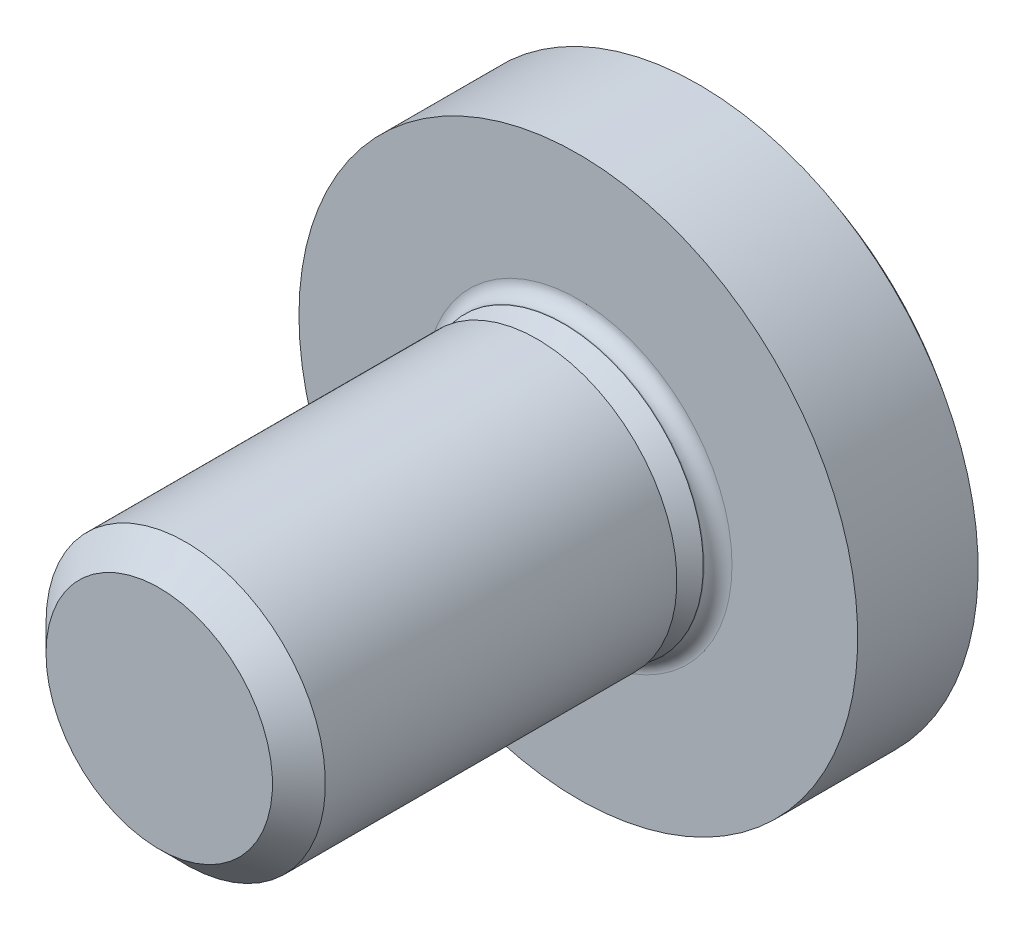
ISO-10303-21;
HEADER;
FILE_DESCRIPTION(('STEP AP214'),'2;1');
FILE_NAME('part.step','',(''),(''),'','','');
FILE_SCHEMA(('AUTOMOTIVE_DESIGN { 1 0 10303 214 1 1 1 1 }'));
ENDSEC;
DATA;
#1=APPLICATION_CONTEXT('core data for automotive mechanical design processes');
#2=APPLICATION_PROTOCOL_DEFINITION('international standard','automotive_design',2000,#1);
#3=PRODUCT_CONTEXT('',#1,'mechanical');
#4=PRODUCT('Part','Part','',(#3));
#5=PRODUCT_RELATED_PRODUCT_CATEGORY('part','',(#4));
#6=PRODUCT_DEFINITION_FORMATION('','',#4);
#7=PRODUCT_DEFINITION_CONTEXT('part definition',#1,'design');
#8=PRODUCT_DEFINITION('design','',#6,#7);
#9=PRODUCT_DEFINITION_SHAPE('','',#8);
#10=(LENGTH_UNIT() NAMED_UNIT(*) SI_UNIT(.MILLI.,.METRE.));
#11=(NAMED_UNIT(*) PLANE_ANGLE_UNIT() SI_UNIT($,.RADIAN.));
#12=(NAMED_UNIT(*) SI_UNIT($,.STERADIAN.) SOLID_ANGLE_UNIT());
#13=UNCERTAINTY_MEASURE_WITH_UNIT(LENGTH_MEASURE(1.E-05),#10,'distance_accuracy_value','');
#14=(GEOMETRIC_REPRESENTATION_CONTEXT(3) GLOBAL_UNCERTAINTY_ASSIGNED_CONTEXT((#13)) GLOBAL_UNIT_ASSIGNED_CONTEXT((#10,
#11,#12)) REPRESENTATION_CONTEXT('',''));
#15=CARTESIAN_POINT('',(0.,0.,0.));
#16=DIRECTION('',(0.,0.,1.));
#17=DIRECTION('',(1.,0.,0.));
#18=AXIS2_PLACEMENT_3D('',#15,#16,#17);
#19=CARTESIAN_POINT('',(0.,0.,6.5));
#20=DIRECTION('',(0.,0.,-1.));
#21=DIRECTION('',(0.,1.,0.));
#22=AXIS2_PLACEMENT_3D('',#19,#20,#21);
#23=SPHERICAL_SURFACE('',#22,6.5);
#24=CARTESIAN_POINT('',(0.,0.,1.3765246170202));
#25=DIRECTION('',(0.,0.,-1.));
#26=DIRECTION('',(-1.,0.,0.));
#27=AXIS2_PLACEMENT_3D('',#24,#25,#26);
#28=CIRCLE('',#27,4.);
#29=CARTESIAN_POINT('',(-4.,0.,1.3765246170202));
#30=VERTEX_POINT('',#29);
#31=EDGE_CURVE('E161',#30,#30,#28,.T.);
#32=ORIENTED_EDGE('',*,*,#31,.T.);
#33=EDGE_LOOP('',(#32));
#34=FACE_BOUND('',#33,.T.);
#35=CARTESIAN_POINT('',(-0.405545392562274,0.189108922281263,6.3801008200685));
#36=DIRECTION('',(-0.875426098065593,0.408217893676735,-0.258819045102521));
#37=DIRECTION('',(-0.422618261740699,-0.90630778703665,0.));
#38=AXIS2_PLACEMENT_3D('',#35,#36,#37);
#39=CIRCLE('',#38,6.48347090197349);
#40=CARTESIAN_POINT('',(0.92299563807694,-0.92299563807694,0.132413478861721));
#41=VERTEX_POINT('',#40);
#42=CARTESIAN_POINT('',(0.305622674506346,-2.10418012593627,0.35760463838069));
#43=VERTEX_POINT('',#42);
#44=EDGE_CURVE('E11',#41,#43,#39,.T.);
#45=ORIENTED_EDGE('',*,*,#44,.F.);
#46=CARTESIAN_POINT('',(-0.189108922281263,0.405545392562274,6.3801008200685));
#47=DIRECTION('',(-0.408217893676735,0.875426098065593,-0.258819045102521));
#48=DIRECTION('',(-0.90630778703665,-0.422618261740699,0.));
#49=AXIS2_PLACEMENT_3D('',#46,#47,#48);
#50=CIRCLE('',#49,6.48347090197349);
#51=CARTESIAN_POINT('',(2.10418012593627,-0.305622674506346,0.357604638380691));
#52=VERTEX_POINT('',#51);
#53=EDGE_CURVE('E25',#52,#41,#50,.T.);
#54=ORIENTED_EDGE('',*,*,#53,.F.);
#55=CARTESIAN_POINT('',(0.427627944162883,0.,6.61458256229943));
#56=DIRECTION('',(-0.965925826289068,0.,-0.258819045102521));
#57=DIRECTION('',(-0.258819045102521,0.,0.965925826289068));
#58=AXIS2_PLACEMENT_3D('',#55,#56,#57);
#59=CIRCLE('',#58,6.48490594980281);
#60=CARTESIAN_POINT('',(2.10418012593627,0.305622674506346,0.357604638380691));
#61=VERTEX_POINT('',#60);
#62=EDGE_CURVE('E225',#61,#52,#59,.T.);
#63=ORIENTED_EDGE('',*,*,#62,.F.);
#64=CARTESIAN_POINT('',(-0.189108922281263,-0.405545392562275,6.3801008200685));
#65=DIRECTION('',(-0.408217893676735,-0.875426098065593,-0.258819045102521));
#66=DIRECTION('',(0.90630778703665,-0.422618261740699,0.));
#67=AXIS2_PLACEMENT_3D('',#64,#65,#66);
#68=CIRCLE('',#67,6.48347090197349);
#69=CARTESIAN_POINT('',(0.922995638076941,0.922995638076939,0.132413478861721));
#70=VERTEX_POINT('',#69);
#71=EDGE_CURVE('E222',#70,#61,#68,.T.);
#72=ORIENTED_EDGE('',*,*,#71,.F.);
#73=CARTESIAN_POINT('',(-0.405545392562273,-0.189108922281263,6.3801008200685));
#74=DIRECTION('',(-0.875426098065593,-0.408217893676735,-0.258819045102521));
#75=DIRECTION('',(0.422618261740699,-0.90630778703665,0.));
#76=AXIS2_PLACEMENT_3D('',#73,#74,#75);
#77=CIRCLE('',#76,6.48347090197349);
#78=CARTESIAN_POINT('',(0.305622674506346,2.10418012593627,0.35760463838069));
#79=VERTEX_POINT('',#78);
#80=EDGE_CURVE('E219',#79,#70,#77,.T.);
#81=ORIENTED_EDGE('',*,*,#80,.F.);
#82=CARTESIAN_POINT('',(0.,0.427627944162883,6.61458256229943));
#83=DIRECTION('',(0.,-0.965925826289068,-0.258819045102521));
#84=DIRECTION('',(0.,0.258819045102521,-0.965925826289068));
#85=AXIS2_PLACEMENT_3D('',#82,#83,#84);
#86=CIRCLE('',#85,6.48490594980281);
#87=CARTESIAN_POINT('',(-0.305622674506345,2.10418012593627,0.35760463838069));
#88=VERTEX_POINT('',#87);
#89=EDGE_CURVE('E216',#88,#79,#86,.T.);
#90=ORIENTED_EDGE('',*,*,#89,.F.);
#91=CARTESIAN_POINT('',(0.405545392562275,-0.189108922281263,6.3801008200685));
#92=DIRECTION('',(0.875426098065593,-0.408217893676735,-0.258819045102521));
#93=DIRECTION('',(0.422618261740699,0.90630778703665,0.));
#94=AXIS2_PLACEMENT_3D('',#91,#92,#93);
#95=CIRCLE('',#94,6.48347090197349);
#96=CARTESIAN_POINT('',(-0.92299563807694,0.922995638076941,0.132413478861721));
#97=VERTEX_POINT('',#96);
#98=EDGE_CURVE('E213',#97,#88,#95,.T.);
#99=ORIENTED_EDGE('',*,*,#98,.F.);
#100=CARTESIAN_POINT('',(0.189108922281263,-0.405545392562273,6.3801008200685));
#101=DIRECTION('',(0.408217893676735,-0.875426098065593,-0.258819045102521));
#102=DIRECTION('',(0.90630778703665,0.422618261740699,0.));
#103=AXIS2_PLACEMENT_3D('',#100,#101,#102);
#104=CIRCLE('',#103,6.48347090197349);
#105=CARTESIAN_POINT('',(-2.10418012593627,0.305622674506346,0.35760463838069));
#106=VERTEX_POINT('',#105);
#107=EDGE_CURVE('E210',#106,#97,#104,.T.);
#108=ORIENTED_EDGE('',*,*,#107,.F.);
#109=CARTESIAN_POINT('',(-0.427627944162883,0.,6.61458256229943));
#110=DIRECTION('',(0.965925826289068,0.,-0.258819045102521));
#111=DIRECTION('',(-0.258819045102521,0.,-0.965925826289068));
#112=AXIS2_PLACEMENT_3D('',#109,#110,#111);
#113=CIRCLE('',#112,6.48490594980281);
#114=CARTESIAN_POINT('',(-2.10418012593627,-0.305622674506345,0.357604638380691));
#115=VERTEX_POINT('',#114);
#116=EDGE_CURVE('E207',#115,#106,#113,.T.);
#117=ORIENTED_EDGE('',*,*,#116,.F.);
#118=CARTESIAN_POINT('',(0.189108922281264,0.405545392562274,6.3801008200685));
#119=DIRECTION('',(0.408217893676735,0.875426098065593,-0.258819045102521));
#120=DIRECTION('',(-0.90630778703665,0.422618261740699,0.));
#121=AXIS2_PLACEMENT_3D('',#118,#119,#120);
#122=CIRCLE('',#121,6.48347090197349);
#123=CARTESIAN_POINT('',(-0.922995638076941,-0.92299563807694,0.132413478861721));
#124=VERTEX_POINT('',#123);
#125=EDGE_CURVE('E204',#124,#115,#122,.T.);
#126=ORIENTED_EDGE('',*,*,#125,.F.);
#127=CARTESIAN_POINT('',(0.405545392562273,0.189108922281263,6.3801008200685));
#128=DIRECTION('',(0.875426098065593,0.408217893676735,-0.258819045102521));
#129=DIRECTION('',(-0.422618261740699,0.90630778703665,0.));
#130=AXIS2_PLACEMENT_3D('',#127,#128,#129);
#131=CIRCLE('',#130,6.48347090197349);
#132=CARTESIAN_POINT('',(-0.305622674506346,-2.10418012593627,0.357604638380691));
#133=VERTEX_POINT('',#132);
#134=EDGE_CURVE('E201',#133,#124,#131,.T.);
#135=ORIENTED_EDGE('',*,*,#134,.F.);
#136=CARTESIAN_POINT('',(0.,-0.427627944162883,6.61458256229943));
#137=DIRECTION('',(0.,0.965925826289068,-0.258819045102521));
#138=DIRECTION('',(0.,0.258819045102521,0.965925826289068));
#139=AXIS2_PLACEMENT_3D('',#136,#137,#138);
#140=CIRCLE('',#139,6.48490594980281);
#141=EDGE_CURVE('E198',#43,#133,#140,.T.);
#142=ORIENTED_EDGE('',*,*,#141,.F.);
#143=EDGE_LOOP('',(#45,#54,#63,#72,#81,#90,#99,#108,#117,#126,#135,#142));
#144=FACE_BOUND('',#143,.T.);
#145=ADVANCED_FACE('F16',(#34,#144),#23,.T.);
#146=CARTESIAN_POINT('',(0.,0.,9.1));
#147=DIRECTION('',(0.,0.,-1.));
#148=DIRECTION('',(-1.,0.,0.));
#149=AXIS2_PLACEMENT_3D('',#146,#147,#148);
#150=PLANE('',#149);
#151=CARTESIAN_POINT('',(0.,0.,9.1));
#152=DIRECTION('',(0.,0.,-1.));
#153=DIRECTION('',(-1.,0.,0.));
#154=AXIS2_PLACEMENT_3D('',#151,#152,#153);
#155=CIRCLE('',#154,1.621125);
#156=CARTESIAN_POINT('',(-1.621125,0.,9.1));
#157=VERTEX_POINT('',#156);
#158=EDGE_CURVE('E194',#157,#157,#155,.T.);
#159=ORIENTED_EDGE('',*,*,#158,.F.);
#160=EDGE_LOOP('',(#159));
#161=FACE_BOUND('',#160,.T.);
#162=ADVANCED_FACE('F18',(#161),#150,.F.);
#163=CARTESIAN_POINT('',(0.,0.,9.1));
#164=DIRECTION('',(0.,0.,-1.));
#165=DIRECTION('',(-1.,0.,0.));
#166=AXIS2_PLACEMENT_3D('',#163,#164,#165);
#167=CONICAL_SURFACE('',#166,1.621125,0.785398163397449);
#168=CARTESIAN_POINT('',(0.,0.,8.721125));
#169=DIRECTION('',(0.,0.,-1.));
#170=DIRECTION('',(-1.,0.,0.));
#171=AXIS2_PLACEMENT_3D('',#168,#169,#170);
#172=CIRCLE('',#171,2.);
#173=CARTESIAN_POINT('',(-2.,0.,8.721125));
#174=VERTEX_POINT('',#173);
#175=EDGE_CURVE('E190',#174,#174,#172,.T.);
#176=ORIENTED_EDGE('',*,*,#175,.F.);
#177=EDGE_LOOP('',(#176));
#178=FACE_BOUND('',#177,.T.);
#179=ORIENTED_EDGE('',*,*,#158,.T.);
#180=EDGE_LOOP('',(#179));
#181=FACE_BOUND('',#180,.T.);
#182=ADVANCED_FACE('F246',(#178,#181),#167,.T.);
#183=CARTESIAN_POINT('',(0.,0.,0.));
#184=DIRECTION('',(0.,0.,-1.));
#185=DIRECTION('',(-1.,0.,0.));
#186=AXIS2_PLACEMENT_3D('',#183,#184,#185);
#187=CYLINDRICAL_SURFACE('',#186,2.);
#188=CARTESIAN_POINT('',(0.,0.,3.688875));
#189=DIRECTION('',(0.,0.,-1.));
#190=DIRECTION('',(-1.,0.,0.));
#191=AXIS2_PLACEMENT_3D('',#188,#189,#190);
#192=CIRCLE('',#191,2.);
#193=CARTESIAN_POINT('',(-2.,0.,3.688875));
#194=VERTEX_POINT('',#193);
#195=EDGE_CURVE('E186',#194,#194,#192,.T.);
#196=ORIENTED_EDGE('',*,*,#195,.F.);
#197=EDGE_LOOP('',(#196));
#198=FACE_BOUND('',#197,.T.);
#199=ORIENTED_EDGE('',*,*,#175,.T.);
#200=EDGE_LOOP('',(#199));
#201=FACE_BOUND('',#200,.T.);
#202=ADVANCED_FACE('F258',(#198,#201),#187,.T.);
#203=CARTESIAN_POINT('',(0.,2.,3.688875));
#204=DIRECTION('',(0.,0.,1.));
#205=DIRECTION('',(1.,0.,0.));
#206=AXIS2_PLACEMENT_3D('',#203,#204,#205);
#207=PLANE('',#206);
#208=CARTESIAN_POINT('',(0.,0.,3.688875));
#209=DIRECTION('',(0.,0.,-1.));
#210=DIRECTION('',(-1.,0.,0.));
#211=AXIS2_PLACEMENT_3D('',#208,#209,#210);
#212=CIRCLE('',#211,1.621125);
#213=CARTESIAN_POINT('',(-1.621125,0.,3.688875));
#214=VERTEX_POINT('',#213);
#215=EDGE_CURVE('E182',#214,#214,#212,.T.);
#216=ORIENTED_EDGE('',*,*,#215,.F.);
#217=EDGE_LOOP('',(#216));
#218=FACE_BOUND('',#217,.T.);
#219=ORIENTED_EDGE('',*,*,#195,.T.);
#220=EDGE_LOOP('',(#219));
#221=FACE_BOUND('',#220,.T.);
#222=ADVANCED_FACE('F268',(#218,#221),#207,.F.);
#223=CARTESIAN_POINT('',(0.,0.,3.688875));
#224=DIRECTION('',(0.,0.,-1.));
#225=DIRECTION('',(-1.,0.,0.));
#226=AXIS2_PLACEMENT_3D('',#223,#224,#225);
#227=CONICAL_SURFACE('',#226,1.621125,0.785398163397449);
#228=CARTESIAN_POINT('',(0.,0.,3.31));
#229=DIRECTION('',(0.,0.,-1.));
#230=DIRECTION('',(-1.,0.,0.));
#231=AXIS2_PLACEMENT_3D('',#228,#229,#230);
#232=CIRCLE('',#231,2.);
#233=CARTESIAN_POINT('',(-2.,0.,3.31));
#234=VERTEX_POINT('',#233);
#235=EDGE_CURVE('E178',#234,#234,#232,.T.);
#236=ORIENTED_EDGE('',*,*,#235,.F.);
#237=EDGE_LOOP('',(#236));
#238=FACE_BOUND('',#237,.T.);
#239=ORIENTED_EDGE('',*,*,#215,.T.);
#240=EDGE_LOOP('',(#239));
#241=FACE_BOUND('',#240,.T.);
#242=ADVANCED_FACE('F279',(#238,#241),#227,.T.);
#243=CARTESIAN_POINT('',(0.,0.,0.));
#244=DIRECTION('',(0.,0.,-1.));
#245=DIRECTION('',(-1.,0.,0.));
#246=AXIS2_PLACEMENT_3D('',#243,#244,#245);
#247=CYLINDRICAL_SURFACE('',#246,2.);
#248=CARTESIAN_POINT('',(0.,0.,3.3));
#249=DIRECTION('',(0.,0.,-1.));
#250=DIRECTION('',(-1.,0.,0.));
#251=AXIS2_PLACEMENT_3D('',#248,#249,#250);
#252=CIRCLE('',#251,2.);
#253=CARTESIAN_POINT('',(-2.,0.,3.3));
#254=VERTEX_POINT('',#253);
#255=EDGE_CURVE('E174',#254,#254,#252,.T.);
#256=ORIENTED_EDGE('',*,*,#255,.F.);
#257=EDGE_LOOP('',(#256));
#258=FACE_BOUND('',#257,.T.);
#259=ORIENTED_EDGE('',*,*,#235,.T.);
#260=EDGE_LOOP('',(#259));
#261=FACE_BOUND('',#260,.T.);
#262=ADVANCED_FACE('F290',(#258,#261),#247,.T.);
#263=CARTESIAN_POINT('',(0.,0.,3.3));
#264=DIRECTION('',(0.,0.,-1.));
#265=DIRECTION('',(-1.,0.,0.));
#266=AXIS2_PLACEMENT_3D('',#263,#264,#265);
#267=TOROIDAL_SURFACE('',#266,2.2,0.2);
#268=ORIENTED_EDGE('',*,*,#255,.T.);
#269=EDGE_LOOP('',(#268));
#270=FACE_BOUND('',#269,.T.);
#271=CARTESIAN_POINT('',(0.,0.,3.1));
#272=DIRECTION('',(0.,0.,-1.));
#273=DIRECTION('',(-1.,0.,0.));
#274=AXIS2_PLACEMENT_3D('',#271,#272,#273);
#275=CIRCLE('',#274,2.2);
#276=CARTESIAN_POINT('',(-2.2,0.,3.1));
#277=VERTEX_POINT('',#276);
#278=EDGE_CURVE('E170',#277,#277,#275,.T.);
#279=ORIENTED_EDGE('',*,*,#278,.F.);
#280=EDGE_LOOP('',(#279));
#281=FACE_BOUND('',#280,.T.);
#282=ADVANCED_FACE('F301',(#270,#281),#267,.F.);
#283=CARTESIAN_POINT('',(0.,2.2,3.1));
#284=DIRECTION('',(0.,0.,-1.));
#285=DIRECTION('',(-1.,0.,0.));
#286=AXIS2_PLACEMENT_3D('',#283,#284,#285);
#287=PLANE('',#286);
#288=CARTESIAN_POINT('',(0.,0.,3.1));
#289=DIRECTION('',(0.,0.,-1.));
#290=DIRECTION('',(-1.,0.,0.));
#291=AXIS2_PLACEMENT_3D('',#288,#289,#290);
#292=CIRCLE('',#291,4.);
#293=CARTESIAN_POINT('',(-4.,0.,3.1));
#294=VERTEX_POINT('',#293);
#295=EDGE_CURVE('E165',#294,#294,#292,.T.);
#296=ORIENTED_EDGE('',*,*,#295,.F.);
#297=EDGE_LOOP('',(#296));
#298=FACE_BOUND('',#297,.T.);
#299=ORIENTED_EDGE('',*,*,#278,.T.);
#300=EDGE_LOOP('',(#299));
#301=FACE_BOUND('',#300,.T.);
#302=ADVANCED_FACE('F312',(#298,#301),#287,.F.);
#303=CARTESIAN_POINT('',(0.,0.,0.));
#304=DIRECTION('',(0.,0.,-1.));
#305=DIRECTION('',(-1.,0.,0.));
#306=AXIS2_PLACEMENT_3D('',#303,#304,#305);
#307=CYLINDRICAL_SURFACE('',#306,4.);
#308=ORIENTED_EDGE('',*,*,#31,.F.);
#309=EDGE_LOOP('',(#308));
#310=FACE_BOUND('',#309,.T.);
#311=ORIENTED_EDGE('',*,*,#295,.T.);
#312=EDGE_LOOP('',(#311));
#313=FACE_BOUND('',#312,.T.);
#314=ADVANCED_FACE('F323',(#310,#313),#307,.T.);
#315=CARTESIAN_POINT('',(0.366666666666667,-2.2,0.));
#316=DIRECTION('',(-0.875426098065593,0.408217893676735,-0.258819045102521));
#317=DIRECTION('',(-0.422618261740699,-0.90630778703665,0.));
#318=AXIS2_PLACEMENT_3D('',#315,#316,#317);
#319=PLANE('',#318);
#320=ORIENTED_EDGE('',*,*,#44,.T.);
#321=DIRECTION('',(0.162689201767992,-0.255370893567974,-0.953057149569945));
#322=VECTOR('',#321,1.);
#323=CARTESIAN_POINT('',(0.366666666666667,-2.2,0.));
#324=LINE('',#323,#322);
#325=CARTESIAN_POINT('',(0.0423319890466869,-1.69089653438087,1.9));
#326=VERTEX_POINT('',#325);
#327=EDGE_CURVE('E32',#326,#43,#324,.T.);
#328=ORIENTED_EDGE('',*,*,#327,.F.);
#329=DIRECTION('',(0.422618261740699,0.90630778703665,0.));
#330=VECTOR('',#329,1.);
#331=CARTESIAN_POINT('',(0.149047069992156,-1.46204530477057,1.9));
#332=LINE('',#331,#330);
#333=CARTESIAN_POINT('',(0.566600049829658,-0.566600049829659,1.9));
#334=VERTEX_POINT('',#333);
#335=EDGE_CURVE('E118',#326,#334,#332,.T.);
#336=ORIENTED_EDGE('',*,*,#335,.T.);
#337=DIRECTION('',(0.193899607686987,-0.193899607686987,-0.961668281829896));
#338=VECTOR('',#337,1.);
#339=CARTESIAN_POINT('',(0.974781670177971,-0.974781670177972,-0.12442553751102));
#340=LINE('',#339,#338);
#341=EDGE_CURVE('E166',#334,#41,#340,.T.);
#342=ORIENTED_EDGE('',*,*,#341,.T.);
#343=EDGE_LOOP('',(#320,#328,#336,#342));
#344=FACE_BOUND('',#343,.T.);
#345=ADVANCED_FACE('F117',(#344),#319,.T.);
#346=CARTESIAN_POINT('',(0.949693951922647,-0.949693951922649,0.));
#347=DIRECTION('',(-0.408217893676735,0.875426098065593,-0.258819045102521));
#348=DIRECTION('',(-0.90630778703665,-0.422618261740699,0.));
#349=AXIS2_PLACEMENT_3D('',#346,#347,#348);
#350=PLANE('',#349);
#351=ORIENTED_EDGE('',*,*,#53,.T.);
#352=ORIENTED_EDGE('',*,*,#341,.F.);
#353=DIRECTION('',(0.90630778703665,0.422618261740699,0.));
#354=VECTOR('',#353,1.);
#355=CARTESIAN_POINT('',(0.177234242228863,-0.748164307737616,1.9));
#356=LINE('',#355,#354);
#357=CARTESIAN_POINT('',(1.69089653438087,-0.0423319890466872,1.9));
#358=VERTEX_POINT('',#357);
#359=EDGE_CURVE('E125',#334,#358,#356,.T.);
#360=ORIENTED_EDGE('',*,*,#359,.T.);
#361=DIRECTION('',(0.255370893567974,-0.162689201767992,-0.953057149569945));
#362=VECTOR('',#361,1.);
#363=CARTESIAN_POINT('',(2.2,-0.366666666666667,0.));
#364=LINE('',#363,#362);
#365=EDGE_CURVE('E568',#358,#52,#364,.T.);
#366=ORIENTED_EDGE('',*,*,#365,.T.);
#367=EDGE_LOOP('',(#351,#352,#360,#366));
#368=FACE_BOUND('',#367,.T.);
#369=ADVANCED_FACE('F343',(#368),#350,.T.);
#370=CARTESIAN_POINT('',(2.2,-0.366666666666667,0.));
#371=DIRECTION('',(-0.965925826289068,0.,-0.258819045102521));
#372=DIRECTION('',(-0.258819045102521,0.,0.965925826289068));
#373=AXIS2_PLACEMENT_3D('',#370,#371,#372);
#374=PLANE('',#373);
#375=ORIENTED_EDGE('',*,*,#62,.T.);
#376=ORIENTED_EDGE('',*,*,#365,.F.);
#377=DIRECTION('',(0.,1.,0.));
#378=VECTOR('',#377,1.);
#379=CARTESIAN_POINT('',(1.69089653438087,-1.67720172645669,1.9));
#380=LINE('',#379,#378);
#381=CARTESIAN_POINT('',(1.69089653438087,0.0423319890466869,1.9));
#382=VERTEX_POINT('',#381);
#383=EDGE_CURVE('E132',#358,#382,#380,.T.);
#384=ORIENTED_EDGE('',*,*,#383,.T.);
#385=DIRECTION('',(0.255370893567974,0.162689201767992,-0.953057149569945));
#386=VECTOR('',#385,1.);
#387=CARTESIAN_POINT('',(2.2,0.366666666666667,0.));
#388=LINE('',#387,#386);
#389=EDGE_CURVE('E565',#382,#61,#388,.T.);
#390=ORIENTED_EDGE('',*,*,#389,.T.);
#391=EDGE_LOOP('',(#375,#376,#384,#390));
#392=FACE_BOUND('',#391,.T.);
#393=ADVANCED_FACE('F360',(#392),#374,.T.);
#394=CARTESIAN_POINT('',(2.2,0.366666666666667,0.));
#395=DIRECTION('',(-0.408217893676735,-0.875426098065593,-0.258819045102521));
#396=DIRECTION('',(0.90630778703665,-0.422618261740699,0.));
#397=AXIS2_PLACEMENT_3D('',#394,#395,#396);
#398=PLANE('',#397);
#399=ORIENTED_EDGE('',*,*,#71,.T.);
#400=ORIENTED_EDGE('',*,*,#389,.F.);
#401=DIRECTION('',(-0.90630778703665,0.422618261740699,0.));
#402=VECTOR('',#401,1.);
#403=CARTESIAN_POINT('',(1.46204530477057,0.149047069992157,1.9));
#404=LINE('',#403,#402);
#405=CARTESIAN_POINT('',(0.566600049829659,0.566600049829658,1.9));
#406=VERTEX_POINT('',#405);
#407=EDGE_CURVE('E138',#382,#406,#404,.T.);
#408=ORIENTED_EDGE('',*,*,#407,.T.);
#409=DIRECTION('',(0.193899607686987,0.193899607686987,-0.961668281829896));
#410=VECTOR('',#409,1.);
#411=CARTESIAN_POINT('',(0.974781670177972,0.97478167017797,-0.12442553751102));
#412=LINE('',#411,#410);
#413=EDGE_CURVE('E562',#406,#70,#412,.T.);
#414=ORIENTED_EDGE('',*,*,#413,.T.);
#415=EDGE_LOOP('',(#399,#400,#408,#414));
#416=FACE_BOUND('',#415,.T.);
#417=ADVANCED_FACE('F370',(#416),#398,.T.);
#418=CARTESIAN_POINT('',(0.949693951922649,0.949693951922647,0.));
#419=DIRECTION('',(-0.875426098065593,-0.408217893676735,-0.258819045102521));
#420=DIRECTION('',(0.422618261740699,-0.90630778703665,0.));
#421=AXIS2_PLACEMENT_3D('',#418,#419,#420);
#422=PLANE('',#421);
#423=ORIENTED_EDGE('',*,*,#80,.T.);
#424=ORIENTED_EDGE('',*,*,#413,.F.);
#425=DIRECTION('',(-0.422618261740699,0.90630778703665,0.));
#426=VECTOR('',#425,1.);
#427=CARTESIAN_POINT('',(1.43385813253386,-1.29324091039736,1.9));
#428=LINE('',#427,#426);
#429=CARTESIAN_POINT('',(0.0423319890466871,1.69089653438087,1.9));
#430=VERTEX_POINT('',#429);
#431=EDGE_CURVE('E141',#406,#430,#428,.T.);
#432=ORIENTED_EDGE('',*,*,#431,.T.);
#433=DIRECTION('',(0.162689201767992,0.255370893567974,-0.953057149569945));
#434=VECTOR('',#433,1.);
#435=CARTESIAN_POINT('',(0.366666666666667,2.2,0.));
#436=LINE('',#435,#434);
#437=EDGE_CURVE('E559',#430,#79,#436,.T.);
#438=ORIENTED_EDGE('',*,*,#437,.T.);
#439=EDGE_LOOP('',(#423,#424,#432,#438));
#440=FACE_BOUND('',#439,.T.);
#441=ADVANCED_FACE('F382',(#440),#422,.T.);
#442=CARTESIAN_POINT('',(0.366666666666667,2.2,0.));
#443=DIRECTION('',(0.,-0.965925826289068,-0.258819045102521));
#444=DIRECTION('',(0.,0.258819045102521,-0.965925826289068));
#445=AXIS2_PLACEMENT_3D('',#442,#443,#444);
#446=PLANE('',#445);
#447=ORIENTED_EDGE('',*,*,#89,.T.);
#448=ORIENTED_EDGE('',*,*,#437,.F.);
#449=DIRECTION('',(-1.,0.,0.));
#450=VECTOR('',#449,1.);
#451=CARTESIAN_POINT('',(0.610451505290122,1.69089653438087,1.9));
#452=LINE('',#451,#450);
#453=CARTESIAN_POINT('',(-0.0423319890466866,1.69089653438087,1.9));
#454=VERTEX_POINT('',#453);
#455=EDGE_CURVE('E144',#430,#454,#452,.T.);
#456=ORIENTED_EDGE('',*,*,#455,.T.);
#457=DIRECTION('',(-0.162689201767992,0.255370893567974,-0.953057149569945));
#458=VECTOR('',#457,1.);
#459=CARTESIAN_POINT('',(-0.366666666666667,2.2,0.));
#460=LINE('',#459,#458);
#461=EDGE_CURVE('E556',#454,#88,#460,.T.);
#462=ORIENTED_EDGE('',*,*,#461,.T.);
#463=EDGE_LOOP('',(#447,#448,#456,#462));
#464=FACE_BOUND('',#463,.T.);
#465=ADVANCED_FACE('F394',(#464),#446,.T.);
#466=CARTESIAN_POINT('',(-0.366666666666667,2.2,0.));
#467=DIRECTION('',(0.875426098065593,-0.408217893676735,-0.258819045102521));
#468=DIRECTION('',(0.422618261740699,0.90630778703665,0.));
#469=AXIS2_PLACEMENT_3D('',#466,#467,#468);
#470=PLANE('',#469);
#471=ORIENTED_EDGE('',*,*,#98,.T.);
#472=ORIENTED_EDGE('',*,*,#461,.F.);
#473=DIRECTION('',(-0.422618261740699,-0.90630778703665,0.));
#474=VECTOR('',#473,1.);
#475=CARTESIAN_POINT('',(-1.21579729115873,-0.825607926976247,1.9));
#476=LINE('',#475,#474);
#477=CARTESIAN_POINT('',(-0.566600049829658,0.56660004982966,1.9));
#478=VERTEX_POINT('',#477);
#479=EDGE_CURVE('E147',#454,#478,#476,.T.);
#480=ORIENTED_EDGE('',*,*,#479,.T.);
#481=DIRECTION('',(-0.193899607686987,0.193899607686987,-0.961668281829896));
#482=VECTOR('',#481,1.);
#483=CARTESIAN_POINT('',(-0.97478167017797,0.974781670177972,-0.12442553751102));
#484=LINE('',#483,#482);
#485=EDGE_CURVE('E553',#478,#97,#484,.T.);
#486=ORIENTED_EDGE('',*,*,#485,.T.);
#487=EDGE_LOOP('',(#471,#472,#480,#486));
#488=FACE_BOUND('',#487,.T.);
#489=ADVANCED_FACE('F406',(#488),#470,.T.);
#490=CARTESIAN_POINT('',(-0.949693951922647,0.949693951922649,0.));
#491=DIRECTION('',(0.408217893676735,-0.875426098065593,-0.258819045102521));
#492=DIRECTION('',(0.90630778703665,0.422618261740699,0.));
#493=AXIS2_PLACEMENT_3D('',#490,#491,#492);
#494=PLANE('',#493);
#495=ORIENTED_EDGE('',*,*,#107,.T.);
#496=ORIENTED_EDGE('',*,*,#485,.F.);
#497=DIRECTION('',(-0.90630778703665,-0.422618261740699,0.));
#498=VECTOR('',#497,1.);
#499=CARTESIAN_POINT('',(-0.459203135565461,0.616680053413271,1.9));
#500=LINE('',#499,#498);
#501=CARTESIAN_POINT('',(-1.69089653438087,0.0423319890466875,1.9));
#502=VERTEX_POINT('',#501);
#503=EDGE_CURVE('E150',#478,#502,#500,.T.);
#504=ORIENTED_EDGE('',*,*,#503,.T.);
#505=DIRECTION('',(-0.255370893567974,0.162689201767992,-0.953057149569945));
#506=VECTOR('',#505,1.);
#507=CARTESIAN_POINT('',(-2.2,0.366666666666668,0.));
#508=LINE('',#507,#506);
#509=EDGE_CURVE('E550',#502,#106,#508,.T.);
#510=ORIENTED_EDGE('',*,*,#509,.T.);
#511=EDGE_LOOP('',(#495,#496,#504,#510));
#512=FACE_BOUND('',#511,.T.);
#513=ADVANCED_FACE('F418',(#512),#494,.T.);
#514=CARTESIAN_POINT('',(-2.2,0.366666666666668,0.));
#515=DIRECTION('',(0.965925826289068,0.,-0.258819045102521));
#516=DIRECTION('',(-0.258819045102521,0.,-0.965925826289068));
#517=AXIS2_PLACEMENT_3D('',#514,#515,#516);
#518=PLANE('',#517);
#519=ORIENTED_EDGE('',*,*,#116,.T.);
#520=ORIENTED_EDGE('',*,*,#509,.F.);
#521=DIRECTION('',(0.,-1.,0.));
#522=VECTOR('',#521,1.);
#523=CARTESIAN_POINT('',(-1.69089653438087,-1.67720172645669,1.9));
#524=LINE('',#523,#522);
#525=CARTESIAN_POINT('',(-1.69089653438087,-0.0423319890466864,1.9));
#526=VERTEX_POINT('',#525);
#527=EDGE_CURVE('E153',#502,#526,#524,.T.);
#528=ORIENTED_EDGE('',*,*,#527,.T.);
#529=DIRECTION('',(-0.255370893567974,-0.162689201767992,-0.953057149569945));
#530=VECTOR('',#529,1.);
#531=CARTESIAN_POINT('',(-2.2,-0.366666666666667,0.));
#532=LINE('',#531,#530);
#533=EDGE_CURVE('E545',#526,#115,#532,.T.);
#534=ORIENTED_EDGE('',*,*,#533,.T.);
#535=EDGE_LOOP('',(#519,#520,#528,#534));
#536=FACE_BOUND('',#535,.T.);
#537=ADVANCED_FACE('F430',(#536),#518,.T.);
#538=CARTESIAN_POINT('',(-2.2,-0.366666666666667,0.));
#539=DIRECTION('',(0.408217893676735,0.875426098065593,-0.258819045102521));
#540=DIRECTION('',(-0.90630778703665,0.422618261740699,0.));
#541=AXIS2_PLACEMENT_3D('',#538,#539,#540);
#542=PLANE('',#541);
#543=ORIENTED_EDGE('',*,*,#125,.T.);
#544=ORIENTED_EDGE('',*,*,#533,.F.);
#545=DIRECTION('',(0.90630778703665,-0.422618261740699,0.));
#546=VECTOR('',#545,1.);
#547=CARTESIAN_POINT('',(0.825607926976246,-1.21579729115873,1.9));
#548=LINE('',#547,#546);
#549=CARTESIAN_POINT('',(-0.56660004982966,-0.566600049829658,1.9));
#550=VERTEX_POINT('',#549);
#551=EDGE_CURVE('E156',#526,#550,#548,.T.);
#552=ORIENTED_EDGE('',*,*,#551,.T.);
#553=DIRECTION('',(-0.193899607686987,-0.193899607686987,-0.961668281829896));
#554=VECTOR('',#553,1.);
#555=CARTESIAN_POINT('',(-0.974781670177972,-0.97478167017797,-0.12442553751102));
#556=LINE('',#555,#554);
#557=EDGE_CURVE('E542',#550,#124,#556,.T.);
#558=ORIENTED_EDGE('',*,*,#557,.T.);
#559=EDGE_LOOP('',(#543,#544,#552,#558));
#560=FACE_BOUND('',#559,.T.);
#561=ADVANCED_FACE('F442',(#560),#542,.T.);
#562=CARTESIAN_POINT('',(-0.949693951922649,-0.949693951922647,0.));
#563=DIRECTION('',(0.875426098065593,0.408217893676735,-0.258819045102521));
#564=DIRECTION('',(-0.422618261740699,0.90630778703665,0.));
#565=AXIS2_PLACEMENT_3D('',#562,#563,#564);
#566=PLANE('',#565);
#567=ORIENTED_EDGE('',*,*,#134,.T.);
#568=ORIENTED_EDGE('',*,*,#557,.F.);
#569=DIRECTION('',(0.422618261740699,-0.90630778703665,0.));
#570=VECTOR('',#569,1.);
#571=CARTESIAN_POINT('',(0.0690137713829782,-1.92967828819168,1.9));
#572=LINE('',#571,#570);
#573=CARTESIAN_POINT('',(-0.0423319890466871,-1.69089653438087,1.9));
#574=VERTEX_POINT('',#573);
#575=EDGE_CURVE('E113',#550,#574,#572,.T.);
#576=ORIENTED_EDGE('',*,*,#575,.T.);
#577=DIRECTION('',(-0.162689201767992,-0.255370893567974,-0.953057149569945));
#578=VECTOR('',#577,1.);
#579=CARTESIAN_POINT('',(-0.366666666666667,-2.2,0.));
#580=LINE('',#579,#578);
#581=EDGE_CURVE('E108',#574,#133,#580,.T.);
#582=ORIENTED_EDGE('',*,*,#581,.T.);
#583=EDGE_LOOP('',(#567,#568,#576,#582));
#584=FACE_BOUND('',#583,.T.);
#585=ADVANCED_FACE('F454',(#584),#566,.T.);
#586=CARTESIAN_POINT('',(-0.366666666666667,-2.2,0.));
#587=DIRECTION('',(0.,0.965925826289068,-0.258819045102521));
#588=DIRECTION('',(0.,0.258819045102521,0.965925826289068));
#589=AXIS2_PLACEMENT_3D('',#586,#587,#588);
#590=PLANE('',#589);
#591=ORIENTED_EDGE('',*,*,#141,.T.);
#592=ORIENTED_EDGE('',*,*,#581,.F.);
#593=DIRECTION('',(1.,0.,0.));
#594=VECTOR('',#593,1.);
#595=CARTESIAN_POINT('',(0.610451505290122,-1.69089653438087,1.9));
#596=LINE('',#595,#594);
#597=EDGE_CURVE('E105',#574,#326,#596,.T.);
#598=ORIENTED_EDGE('',*,*,#597,.T.);
#599=ORIENTED_EDGE('',*,*,#327,.T.);
#600=EDGE_LOOP('',(#591,#592,#598,#599));
#601=FACE_BOUND('',#600,.T.);
#602=ADVANCED_FACE('F106',(#601),#590,.T.);
#603=CARTESIAN_POINT('',(0.610451505290122,-1.67720172645669,1.9));
#604=DIRECTION('',(0.,0.,-1.));
#605=DIRECTION('',(-1.,0.,0.));
#606=AXIS2_PLACEMENT_3D('',#603,#604,#605);
#607=PLANE('',#606);
#608=ORIENTED_EDGE('',*,*,#335,.F.);
#609=ORIENTED_EDGE('',*,*,#597,.F.);
#610=ORIENTED_EDGE('',*,*,#575,.F.);
#611=ORIENTED_EDGE('',*,*,#551,.F.);
#612=ORIENTED_EDGE('',*,*,#527,.F.);
#613=ORIENTED_EDGE('',*,*,#503,.F.);
#614=ORIENTED_EDGE('',*,*,#479,.F.);
#615=ORIENTED_EDGE('',*,*,#455,.F.);
#616=ORIENTED_EDGE('',*,*,#431,.F.);
#617=ORIENTED_EDGE('',*,*,#407,.F.);
#618=ORIENTED_EDGE('',*,*,#383,.F.);
#619=ORIENTED_EDGE('',*,*,#359,.F.);
#620=EDGE_LOOP('',(#608,#609,#610,#611,#612,#613,#614,#615,#616,#617,#618,#619));
#621=FACE_BOUND('',#620,.T.);
#622=ADVANCED_FACE('F123',(#621),#607,.T.);
#623=CLOSED_SHELL('',(#145,#162,#182,#202,#222,#242,#262,#282,#302,#314,#345,#369,#393,#417,
#441,#465,#489,#513,#537,#561,#585,#602,#622));
#624=MANIFOLD_SOLID_BREP('B1',#623);
#625=ADVANCED_BREP_SHAPE_REPRESENTATION('',(#18,#624),#14);
#626=SHAPE_DEFINITION_REPRESENTATION(#9,#625);
ENDSEC;
END-ISO-10303-21;
